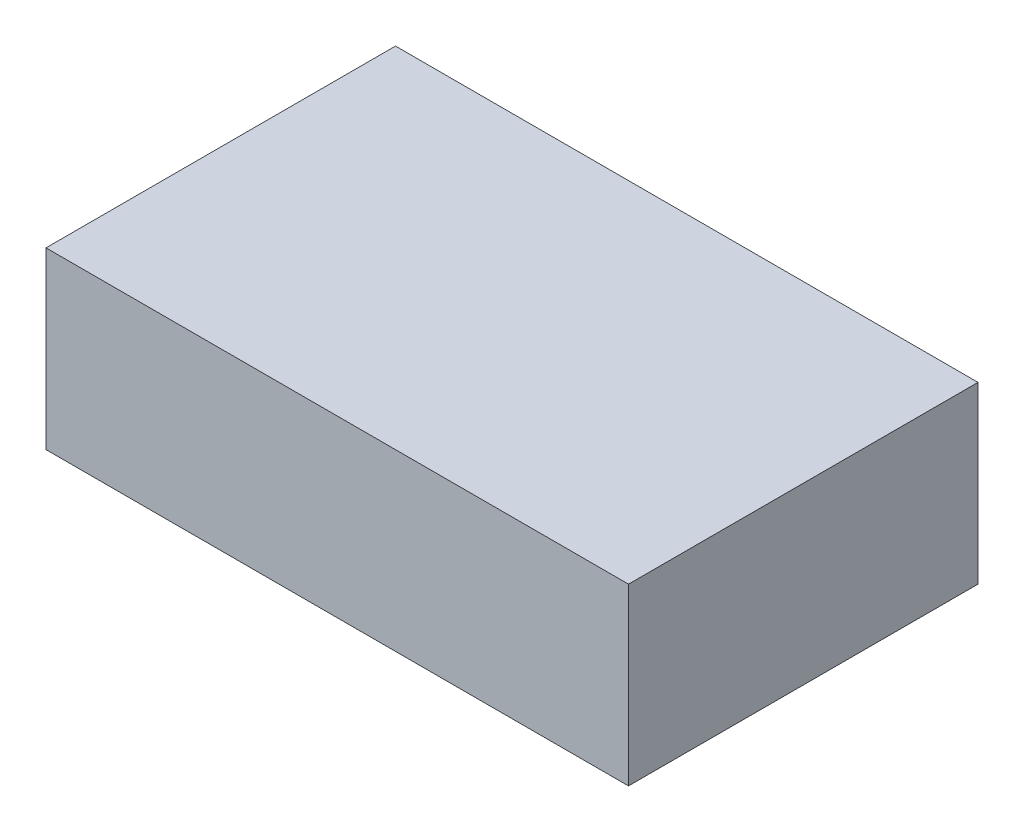
ISO-10303-21;
HEADER;
FILE_DESCRIPTION(('STEP AP214'),'2;1');
FILE_NAME('part.step','',(''),(''),'','','');
FILE_SCHEMA(('AUTOMOTIVE_DESIGN { 1 0 10303 214 1 1 1 1 }'));
ENDSEC;
DATA;
#1=APPLICATION_CONTEXT('core data for automotive mechanical design processes');
#2=APPLICATION_PROTOCOL_DEFINITION('international standard','automotive_design',2000,#1);
#3=PRODUCT_CONTEXT('',#1,'mechanical');
#4=PRODUCT('Part','Part','',(#3));
#5=PRODUCT_RELATED_PRODUCT_CATEGORY('part','',(#4));
#6=PRODUCT_DEFINITION_FORMATION('','',#4);
#7=PRODUCT_DEFINITION_CONTEXT('part definition',#1,'design');
#8=PRODUCT_DEFINITION('design','',#6,#7);
#9=PRODUCT_DEFINITION_SHAPE('','',#8);
#10=(LENGTH_UNIT() NAMED_UNIT(*) SI_UNIT(.MILLI.,.METRE.));
#11=(NAMED_UNIT(*) PLANE_ANGLE_UNIT() SI_UNIT($,.RADIAN.));
#12=(NAMED_UNIT(*) SI_UNIT($,.STERADIAN.) SOLID_ANGLE_UNIT());
#13=UNCERTAINTY_MEASURE_WITH_UNIT(LENGTH_MEASURE(1.E-05),#10,'distance_accuracy_value','');
#14=(GEOMETRIC_REPRESENTATION_CONTEXT(3) GLOBAL_UNCERTAINTY_ASSIGNED_CONTEXT((#13)) GLOBAL_UNIT_ASSIGNED_CONTEXT((#10,
#11,#12)) REPRESENTATION_CONTEXT('',''));
#15=CARTESIAN_POINT('',(0.,0.,0.));
#16=DIRECTION('',(0.,0.,1.));
#17=DIRECTION('',(1.,0.,0.));
#18=AXIS2_PLACEMENT_3D('',#15,#16,#17);
#19=CARTESIAN_POINT('',(5.,3.,3.));
#20=DIRECTION('',(-1.,0.,0.));
#21=DIRECTION('',(0.,0.,1.));
#22=AXIS2_PLACEMENT_3D('',#19,#20,#21);
#23=PLANE('',#22);
#24=DIRECTION('',(0.,0.,-1.));
#25=VECTOR('',#24,1.);
#26=CARTESIAN_POINT('',(5.,0.,3.));
#27=LINE('',#26,#25);
#28=CARTESIAN_POINT('',(5.,0.,3.));
#29=VERTEX_POINT('',#28);
#30=CARTESIAN_POINT('',(5.,0.,-3.));
#31=VERTEX_POINT('',#30);
#32=EDGE_CURVE('E95',#29,#31,#27,.T.);
#33=ORIENTED_EDGE('',*,*,#32,.T.);
#34=DIRECTION('',(0.,-1.,0.));
#35=VECTOR('',#34,1.);
#36=CARTESIAN_POINT('',(5.,3.,-3.));
#37=LINE('',#36,#35);
#38=CARTESIAN_POINT('',(5.,3.,-3.));
#39=VERTEX_POINT('',#38);
#40=EDGE_CURVE('E11',#39,#31,#37,.T.);
#41=ORIENTED_EDGE('',*,*,#40,.F.);
#42=DIRECTION('',(0.,0.,-1.));
#43=VECTOR('',#42,1.);
#44=CARTESIAN_POINT('',(5.,3.,3.));
#45=LINE('',#44,#43);
#46=CARTESIAN_POINT('',(5.,3.,3.));
#47=VERTEX_POINT('',#46);
#48=EDGE_CURVE('E83',#47,#39,#45,.T.);
#49=ORIENTED_EDGE('',*,*,#48,.F.);
#50=DIRECTION('',(0.,-1.,0.));
#51=VECTOR('',#50,1.);
#52=CARTESIAN_POINT('',(5.,3.,3.));
#53=LINE('',#52,#51);
#54=EDGE_CURVE('E91',#47,#29,#53,.T.);
#55=ORIENTED_EDGE('',*,*,#54,.T.);
#56=EDGE_LOOP('',(#33,#41,#49,#55));
#57=FACE_BOUND('',#56,.T.);
#58=ADVANCED_FACE('F32',(#57),#23,.F.);
#59=CARTESIAN_POINT('',(-5.,3.,-3.));
#60=DIRECTION('',(0.,0.,1.));
#61=DIRECTION('',(1.,0.,0.));
#62=AXIS2_PLACEMENT_3D('',#59,#60,#61);
#63=PLANE('',#62);
#64=DIRECTION('',(-1.,0.,0.));
#65=VECTOR('',#64,1.);
#66=CARTESIAN_POINT('',(-5.,0.,-3.));
#67=LINE('',#66,#65);
#68=CARTESIAN_POINT('',(-5.,0.,-3.));
#69=VERTEX_POINT('',#68);
#70=EDGE_CURVE('E87',#31,#69,#67,.T.);
#71=ORIENTED_EDGE('',*,*,#70,.T.);
#72=DIRECTION('',(0.,-1.,0.));
#73=VECTOR('',#72,1.);
#74=CARTESIAN_POINT('',(-5.,3.,-3.));
#75=LINE('',#74,#73);
#76=CARTESIAN_POINT('',(-5.,3.,-3.));
#77=VERTEX_POINT('',#76);
#78=EDGE_CURVE('E40',#77,#69,#75,.T.);
#79=ORIENTED_EDGE('',*,*,#78,.F.);
#80=DIRECTION('',(-1.,0.,0.));
#81=VECTOR('',#80,1.);
#82=CARTESIAN_POINT('',(-5.,3.,-3.));
#83=LINE('',#82,#81);
#84=EDGE_CURVE('E78',#39,#77,#83,.T.);
#85=ORIENTED_EDGE('',*,*,#84,.F.);
#86=ORIENTED_EDGE('',*,*,#40,.T.);
#87=EDGE_LOOP('',(#71,#79,#85,#86));
#88=FACE_BOUND('',#87,.T.);
#89=ADVANCED_FACE('F86',(#88),#63,.F.);
#90=CARTESIAN_POINT('',(-5.,3.,3.));
#91=DIRECTION('',(1.,0.,0.));
#92=DIRECTION('',(0.,0.,-1.));
#93=AXIS2_PLACEMENT_3D('',#90,#91,#92);
#94=PLANE('',#93);
#95=DIRECTION('',(0.,0.,1.));
#96=VECTOR('',#95,1.);
#97=CARTESIAN_POINT('',(-5.,0.,3.));
#98=LINE('',#97,#96);
#99=CARTESIAN_POINT('',(-5.,0.,3.));
#100=VERTEX_POINT('',#99);
#101=EDGE_CURVE('E65',#69,#100,#98,.T.);
#102=ORIENTED_EDGE('',*,*,#101,.T.);
#103=DIRECTION('',(0.,-1.,0.));
#104=VECTOR('',#103,1.);
#105=CARTESIAN_POINT('',(-5.,3.,3.));
#106=LINE('',#105,#104);
#107=CARTESIAN_POINT('',(-5.,3.,3.));
#108=VERTEX_POINT('',#107);
#109=EDGE_CURVE('E88',#108,#100,#106,.T.);
#110=ORIENTED_EDGE('',*,*,#109,.F.);
#111=DIRECTION('',(0.,0.,1.));
#112=VECTOR('',#111,1.);
#113=CARTESIAN_POINT('',(-5.,3.,3.));
#114=LINE('',#113,#112);
#115=EDGE_CURVE('E81',#77,#108,#114,.T.);
#116=ORIENTED_EDGE('',*,*,#115,.F.);
#117=ORIENTED_EDGE('',*,*,#78,.T.);
#118=EDGE_LOOP('',(#102,#110,#116,#117));
#119=FACE_BOUND('',#118,.T.);
#120=ADVANCED_FACE('F89',(#119),#94,.F.);
#121=CARTESIAN_POINT('',(-5.,3.,3.));
#122=DIRECTION('',(0.,0.,-1.));
#123=DIRECTION('',(-1.,0.,0.));
#124=AXIS2_PLACEMENT_3D('',#121,#122,#123);
#125=PLANE('',#124);
#126=DIRECTION('',(1.,0.,0.));
#127=VECTOR('',#126,1.);
#128=CARTESIAN_POINT('',(-5.,0.,3.));
#129=LINE('',#128,#127);
#130=EDGE_CURVE('E71',#100,#29,#129,.T.);
#131=ORIENTED_EDGE('',*,*,#130,.T.);
#132=ORIENTED_EDGE('',*,*,#54,.F.);
#133=DIRECTION('',(1.,0.,0.));
#134=VECTOR('',#133,1.);
#135=CARTESIAN_POINT('',(-5.,3.,3.));
#136=LINE('',#135,#134);
#137=EDGE_CURVE('E48',#108,#47,#136,.T.);
#138=ORIENTED_EDGE('',*,*,#137,.F.);
#139=ORIENTED_EDGE('',*,*,#109,.T.);
#140=EDGE_LOOP('',(#131,#132,#138,#139));
#141=FACE_BOUND('',#140,.T.);
#142=ADVANCED_FACE('F102',(#141),#125,.F.);
#143=CARTESIAN_POINT('',(0.,3.,0.));
#144=DIRECTION('',(0.,-1.,0.));
#145=DIRECTION('',(0.,0.,-1.));
#146=AXIS2_PLACEMENT_3D('',#143,#144,#145);
#147=PLANE('',#146);
#148=ORIENTED_EDGE('',*,*,#48,.T.);
#149=ORIENTED_EDGE('',*,*,#84,.T.);
#150=ORIENTED_EDGE('',*,*,#115,.T.);
#151=ORIENTED_EDGE('',*,*,#137,.T.);
#152=EDGE_LOOP('',(#148,#149,#150,#151));
#153=FACE_BOUND('',#152,.T.);
#154=ADVANCED_FACE('F79',(#153),#147,.F.);
#155=CARTESIAN_POINT('',(0.,0.,0.));
#156=DIRECTION('',(0.,-1.,0.));
#157=DIRECTION('',(0.,0.,-1.));
#158=AXIS2_PLACEMENT_3D('',#155,#156,#157);
#159=PLANE('',#158);
#160=ORIENTED_EDGE('',*,*,#32,.F.);
#161=ORIENTED_EDGE('',*,*,#130,.F.);
#162=ORIENTED_EDGE('',*,*,#101,.F.);
#163=ORIENTED_EDGE('',*,*,#70,.F.);
#164=EDGE_LOOP('',(#160,#161,#162,#163));
#165=FACE_BOUND('',#164,.T.);
#166=ADVANCED_FACE('F105',(#165),#159,.T.);
#167=CLOSED_SHELL('',(#58,#89,#120,#142,#154,#166));
#168=MANIFOLD_SOLID_BREP('B2',#167);
#169=ADVANCED_BREP_SHAPE_REPRESENTATION('',(#18,#168),#14);
#170=SHAPE_DEFINITION_REPRESENTATION(#9,#169);
ENDSEC;
END-ISO-10303-21;
